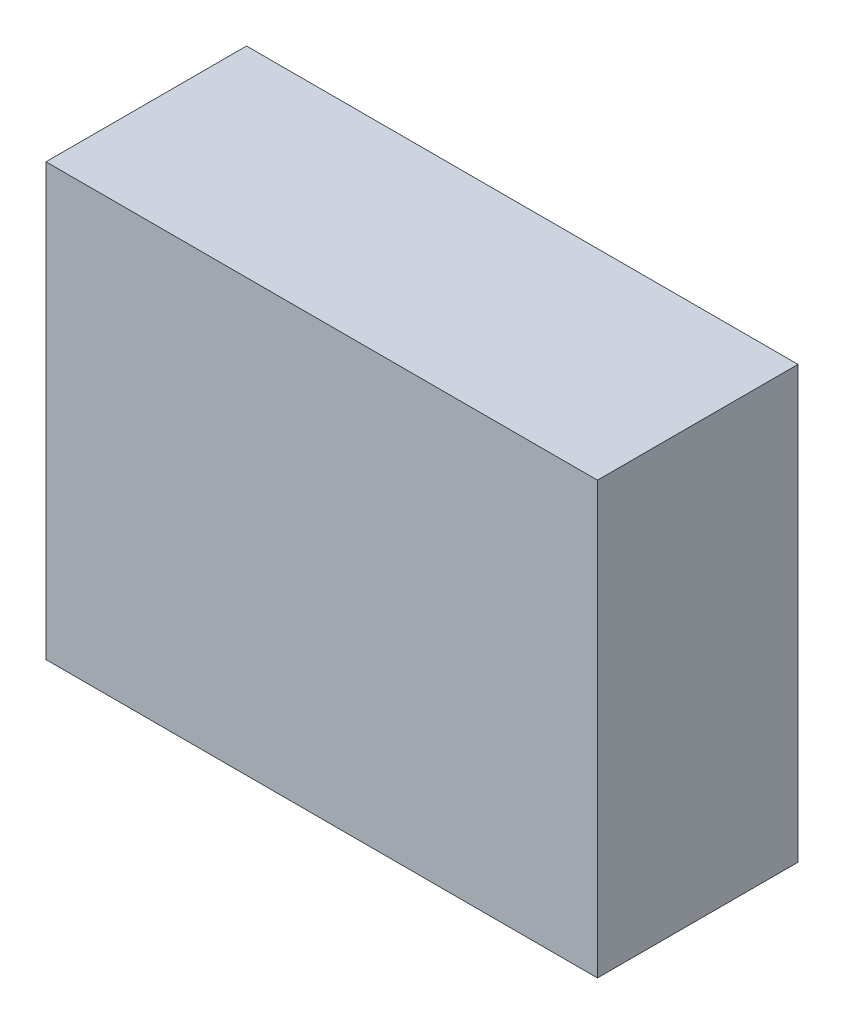
ISO-10303-21;
HEADER;
FILE_DESCRIPTION(('STEP AP214'),'2;1');
FILE_NAME('part.step','',(''),(''),'','','');
FILE_SCHEMA(('AUTOMOTIVE_DESIGN { 1 0 10303 214 1 1 1 1 }'));
ENDSEC;
DATA;
#1=APPLICATION_CONTEXT('core data for automotive mechanical design processes');
#2=APPLICATION_PROTOCOL_DEFINITION('international standard','automotive_design',2000,#1);
#3=PRODUCT_CONTEXT('',#1,'mechanical');
#4=PRODUCT('Part','Part','',(#3));
#5=PRODUCT_RELATED_PRODUCT_CATEGORY('part','',(#4));
#6=PRODUCT_DEFINITION_FORMATION('','',#4);
#7=PRODUCT_DEFINITION_CONTEXT('part definition',#1,'design');
#8=PRODUCT_DEFINITION('design','',#6,#7);
#9=PRODUCT_DEFINITION_SHAPE('','',#8);
#10=(LENGTH_UNIT() NAMED_UNIT(*) SI_UNIT(.MILLI.,.METRE.));
#11=(NAMED_UNIT(*) PLANE_ANGLE_UNIT() SI_UNIT($,.RADIAN.));
#12=(NAMED_UNIT(*) SI_UNIT($,.STERADIAN.) SOLID_ANGLE_UNIT());
#13=UNCERTAINTY_MEASURE_WITH_UNIT(LENGTH_MEASURE(1.E-05),#10,'distance_accuracy_value','');
#14=(GEOMETRIC_REPRESENTATION_CONTEXT(3) GLOBAL_UNCERTAINTY_ASSIGNED_CONTEXT((#13)) GLOBAL_UNIT_ASSIGNED_CONTEXT((#10,
#11,#12)) REPRESENTATION_CONTEXT('',''));
#15=CARTESIAN_POINT('',(0.,0.,0.));
#16=DIRECTION('',(0.,0.,1.));
#17=DIRECTION('',(1.,0.,0.));
#18=AXIS2_PLACEMENT_3D('',#15,#16,#17);
#19=CARTESIAN_POINT('',(-25.,-20.,20.));
#20=DIRECTION('',(1.,0.,0.));
#21=DIRECTION('',(0.,0.,-1.));
#22=AXIS2_PLACEMENT_3D('',#19,#20,#21);
#23=PLANE('',#22);
#24=DIRECTION('',(0.,-1.,0.));
#25=VECTOR('',#24,1.);
#26=CARTESIAN_POINT('',(-25.,-20.,0.));
#27=LINE('',#26,#25);
#28=CARTESIAN_POINT('',(-25.,23.,0.));
#29=VERTEX_POINT('',#28);
#30=CARTESIAN_POINT('',(-25.,-20.,0.));
#31=VERTEX_POINT('',#30);
#32=EDGE_CURVE('E104',#29,#31,#27,.T.);
#33=ORIENTED_EDGE('',*,*,#32,.T.);
#34=DIRECTION('',(0.,0.,-1.));
#35=VECTOR('',#34,1.);
#36=CARTESIAN_POINT('',(-25.,-20.,20.));
#37=LINE('',#36,#35);
#38=CARTESIAN_POINT('',(-25.,-20.,20.));
#39=VERTEX_POINT('',#38);
#40=EDGE_CURVE('E11',#39,#31,#37,.T.);
#41=ORIENTED_EDGE('',*,*,#40,.F.);
#42=DIRECTION('',(0.,-1.,0.));
#43=VECTOR('',#42,1.);
#44=CARTESIAN_POINT('',(-25.,-20.,20.));
#45=LINE('',#44,#43);
#46=CARTESIAN_POINT('',(-25.,23.,20.));
#47=VERTEX_POINT('',#46);
#48=EDGE_CURVE('E92',#47,#39,#45,.T.);
#49=ORIENTED_EDGE('',*,*,#48,.F.);
#50=DIRECTION('',(0.,0.,-1.));
#51=VECTOR('',#50,1.);
#52=CARTESIAN_POINT('',(-25.,23.,20.));
#53=LINE('',#52,#51);
#54=EDGE_CURVE('E100',#47,#29,#53,.T.);
#55=ORIENTED_EDGE('',*,*,#54,.T.);
#56=EDGE_LOOP('',(#33,#41,#49,#55));
#57=FACE_BOUND('',#56,.T.);
#58=ADVANCED_FACE('F41',(#57),#23,.F.);
#59=CARTESIAN_POINT('',(-25.,-20.,20.));
#60=DIRECTION('',(0.,1.,0.));
#61=DIRECTION('',(0.,0.,1.));
#62=AXIS2_PLACEMENT_3D('',#59,#60,#61);
#63=PLANE('',#62);
#64=DIRECTION('',(1.,0.,0.));
#65=VECTOR('',#64,1.);
#66=CARTESIAN_POINT('',(-25.,-20.,0.));
#67=LINE('',#66,#65);
#68=CARTESIAN_POINT('',(30.,-20.,0.));
#69=VERTEX_POINT('',#68);
#70=EDGE_CURVE('E96',#31,#69,#67,.T.);
#71=ORIENTED_EDGE('',*,*,#70,.T.);
#72=DIRECTION('',(0.,0.,-1.));
#73=VECTOR('',#72,1.);
#74=CARTESIAN_POINT('',(30.,-20.,20.));
#75=LINE('',#74,#73);
#76=CARTESIAN_POINT('',(30.,-20.,20.));
#77=VERTEX_POINT('',#76);
#78=EDGE_CURVE('E49',#77,#69,#75,.T.);
#79=ORIENTED_EDGE('',*,*,#78,.F.);
#80=DIRECTION('',(1.,0.,0.));
#81=VECTOR('',#80,1.);
#82=CARTESIAN_POINT('',(-25.,-20.,20.));
#83=LINE('',#82,#81);
#84=EDGE_CURVE('E87',#39,#77,#83,.T.);
#85=ORIENTED_EDGE('',*,*,#84,.F.);
#86=ORIENTED_EDGE('',*,*,#40,.T.);
#87=EDGE_LOOP('',(#71,#79,#85,#86));
#88=FACE_BOUND('',#87,.T.);
#89=ADVANCED_FACE('F95',(#88),#63,.F.);
#90=CARTESIAN_POINT('',(30.,-20.,20.));
#91=DIRECTION('',(-1.,0.,0.));
#92=DIRECTION('',(0.,0.,1.));
#93=AXIS2_PLACEMENT_3D('',#90,#91,#92);
#94=PLANE('',#93);
#95=DIRECTION('',(0.,1.,0.));
#96=VECTOR('',#95,1.);
#97=CARTESIAN_POINT('',(30.,-20.,0.));
#98=LINE('',#97,#96);
#99=CARTESIAN_POINT('',(30.,23.,0.));
#100=VERTEX_POINT('',#99);
#101=EDGE_CURVE('E74',#69,#100,#98,.T.);
#102=ORIENTED_EDGE('',*,*,#101,.T.);
#103=DIRECTION('',(0.,0.,-1.));
#104=VECTOR('',#103,1.);
#105=CARTESIAN_POINT('',(30.,23.,20.));
#106=LINE('',#105,#104);
#107=CARTESIAN_POINT('',(30.,23.,20.));
#108=VERTEX_POINT('',#107);
#109=EDGE_CURVE('E97',#108,#100,#106,.T.);
#110=ORIENTED_EDGE('',*,*,#109,.F.);
#111=DIRECTION('',(0.,1.,0.));
#112=VECTOR('',#111,1.);
#113=CARTESIAN_POINT('',(30.,-20.,20.));
#114=LINE('',#113,#112);
#115=EDGE_CURVE('E90',#77,#108,#114,.T.);
#116=ORIENTED_EDGE('',*,*,#115,.F.);
#117=ORIENTED_EDGE('',*,*,#78,.T.);
#118=EDGE_LOOP('',(#102,#110,#116,#117));
#119=FACE_BOUND('',#118,.T.);
#120=ADVANCED_FACE('F98',(#119),#94,.F.);
#121=CARTESIAN_POINT('',(-25.,23.,20.));
#122=DIRECTION('',(0.,-1.,0.));
#123=DIRECTION('',(0.,0.,-1.));
#124=AXIS2_PLACEMENT_3D('',#121,#122,#123);
#125=PLANE('',#124);
#126=DIRECTION('',(-1.,0.,0.));
#127=VECTOR('',#126,1.);
#128=CARTESIAN_POINT('',(-25.,23.,0.));
#129=LINE('',#128,#127);
#130=EDGE_CURVE('E80',#100,#29,#129,.T.);
#131=ORIENTED_EDGE('',*,*,#130,.T.);
#132=ORIENTED_EDGE('',*,*,#54,.F.);
#133=DIRECTION('',(-1.,0.,0.));
#134=VECTOR('',#133,1.);
#135=CARTESIAN_POINT('',(-25.,23.,20.));
#136=LINE('',#135,#134);
#137=EDGE_CURVE('E57',#108,#47,#136,.T.);
#138=ORIENTED_EDGE('',*,*,#137,.F.);
#139=ORIENTED_EDGE('',*,*,#109,.T.);
#140=EDGE_LOOP('',(#131,#132,#138,#139));
#141=FACE_BOUND('',#140,.T.);
#142=ADVANCED_FACE('F111',(#141),#125,.F.);
#143=CARTESIAN_POINT('',(0.,0.,20.));
#144=DIRECTION('',(0.,0.,-1.));
#145=DIRECTION('',(-1.,0.,0.));
#146=AXIS2_PLACEMENT_3D('',#143,#144,#145);
#147=PLANE('',#146);
#148=ORIENTED_EDGE('',*,*,#48,.T.);
#149=ORIENTED_EDGE('',*,*,#84,.T.);
#150=ORIENTED_EDGE('',*,*,#115,.T.);
#151=ORIENTED_EDGE('',*,*,#137,.T.);
#152=EDGE_LOOP('',(#148,#149,#150,#151));
#153=FACE_BOUND('',#152,.T.);
#154=ADVANCED_FACE('F88',(#153),#147,.F.);
#155=CARTESIAN_POINT('',(0.,0.,0.));
#156=DIRECTION('',(0.,0.,-1.));
#157=DIRECTION('',(-1.,0.,0.));
#158=AXIS2_PLACEMENT_3D('',#155,#156,#157);
#159=PLANE('',#158);
#160=ORIENTED_EDGE('',*,*,#32,.F.);
#161=ORIENTED_EDGE('',*,*,#130,.F.);
#162=ORIENTED_EDGE('',*,*,#101,.F.);
#163=ORIENTED_EDGE('',*,*,#70,.F.);
#164=EDGE_LOOP('',(#160,#161,#162,#163));
#165=FACE_BOUND('',#164,.T.);
#166=ADVANCED_FACE('F114',(#165),#159,.T.);
#167=CLOSED_SHELL('',(#58,#89,#120,#142,#154,#166));
#168=MANIFOLD_SOLID_BREP('B2',#167);
#169=ADVANCED_BREP_SHAPE_REPRESENTATION('',(#18,#168),#14);
#170=SHAPE_DEFINITION_REPRESENTATION(#9,#169);
ENDSEC;
END-ISO-10303-21;
